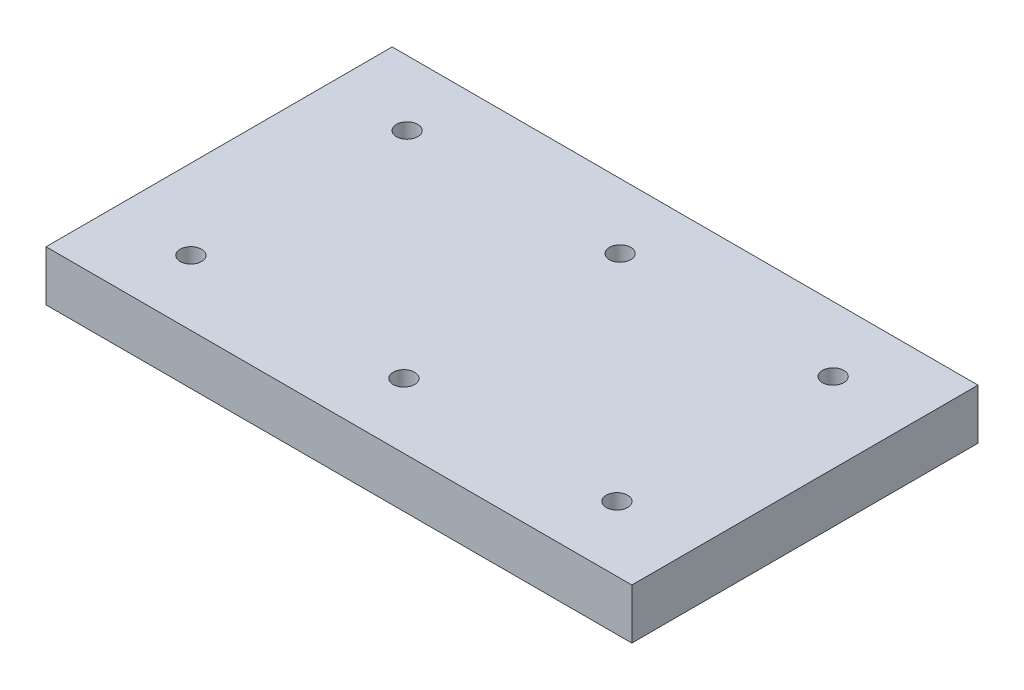
ISO-10303-21;
HEADER;
FILE_DESCRIPTION(('STEP AP214'),'2;1');
FILE_NAME('part.step','',(''),(''),'','','');
FILE_SCHEMA(('AUTOMOTIVE_DESIGN { 1 0 10303 214 1 1 1 1 }'));
ENDSEC;
DATA;
#1=APPLICATION_CONTEXT('core data for automotive mechanical design processes');
#2=APPLICATION_PROTOCOL_DEFINITION('international standard','automotive_design',2000,#1);
#3=PRODUCT_CONTEXT('',#1,'mechanical');
#4=PRODUCT('Part','Part','',(#3));
#5=PRODUCT_RELATED_PRODUCT_CATEGORY('part','',(#4));
#6=PRODUCT_DEFINITION_FORMATION('','',#4);
#7=PRODUCT_DEFINITION_CONTEXT('part definition',#1,'design');
#8=PRODUCT_DEFINITION('design','',#6,#7);
#9=PRODUCT_DEFINITION_SHAPE('','',#8);
#10=(LENGTH_UNIT() NAMED_UNIT(*) SI_UNIT(.MILLI.,.METRE.));
#11=(NAMED_UNIT(*) PLANE_ANGLE_UNIT() SI_UNIT($,.RADIAN.));
#12=(NAMED_UNIT(*) SI_UNIT($,.STERADIAN.) SOLID_ANGLE_UNIT());
#13=UNCERTAINTY_MEASURE_WITH_UNIT(LENGTH_MEASURE(1.E-05),#10,'distance_accuracy_value','');
#14=(GEOMETRIC_REPRESENTATION_CONTEXT(3) GLOBAL_UNCERTAINTY_ASSIGNED_CONTEXT((#13)) GLOBAL_UNIT_ASSIGNED_CONTEXT((#10,
#11,#12)) REPRESENTATION_CONTEXT('',''));
#15=CARTESIAN_POINT('',(0.,0.,0.));
#16=DIRECTION('',(0.,0.,1.));
#17=DIRECTION('',(1.,0.,0.));
#18=AXIS2_PLACEMENT_3D('',#15,#16,#17);
#19=CARTESIAN_POINT('',(69.85,12.,41.275));
#20=DIRECTION('',(-1.,0.,0.));
#21=DIRECTION('',(0.,0.,1.));
#22=AXIS2_PLACEMENT_3D('',#19,#20,#21);
#23=PLANE('',#22);
#24=DIRECTION('',(0.,0.,-1.));
#25=VECTOR('',#24,1.);
#26=CARTESIAN_POINT('',(69.85,0.,41.275));
#27=LINE('',#26,#25);
#28=CARTESIAN_POINT('',(69.85,0.,41.275));
#29=VERTEX_POINT('',#28);
#30=CARTESIAN_POINT('',(69.85,0.,-41.275));
#31=VERTEX_POINT('',#30);
#32=EDGE_CURVE('E100',#29,#31,#27,.T.);
#33=ORIENTED_EDGE('',*,*,#32,.T.);
#34=DIRECTION('',(0.,-1.,0.));
#35=VECTOR('',#34,1.);
#36=CARTESIAN_POINT('',(69.85,12.,-41.275));
#37=LINE('',#36,#35);
#38=CARTESIAN_POINT('',(69.85,12.,-41.275));
#39=VERTEX_POINT('',#38);
#40=EDGE_CURVE('E11',#39,#31,#37,.T.);
#41=ORIENTED_EDGE('',*,*,#40,.F.);
#42=DIRECTION('',(0.,0.,-1.));
#43=VECTOR('',#42,1.);
#44=CARTESIAN_POINT('',(69.85,12.,41.275));
#45=LINE('',#44,#43);
#46=CARTESIAN_POINT('',(69.85,12.,41.275));
#47=VERTEX_POINT('',#46);
#48=EDGE_CURVE('E88',#47,#39,#45,.T.);
#49=ORIENTED_EDGE('',*,*,#48,.F.);
#50=DIRECTION('',(0.,-1.,0.));
#51=VECTOR('',#50,1.);
#52=CARTESIAN_POINT('',(69.85,12.,41.275));
#53=LINE('',#52,#51);
#54=EDGE_CURVE('E96',#47,#29,#53,.T.);
#55=ORIENTED_EDGE('',*,*,#54,.T.);
#56=EDGE_LOOP('',(#33,#41,#49,#55));
#57=FACE_BOUND('',#56,.T.);
#58=ADVANCED_FACE('F37',(#57),#23,.F.);
#59=CARTESIAN_POINT('',(-69.85,12.,-41.275));
#60=DIRECTION('',(0.,0.,1.));
#61=DIRECTION('',(1.,0.,0.));
#62=AXIS2_PLACEMENT_3D('',#59,#60,#61);
#63=PLANE('',#62);
#64=DIRECTION('',(-1.,0.,0.));
#65=VECTOR('',#64,1.);
#66=CARTESIAN_POINT('',(-69.85,0.,-41.275));
#67=LINE('',#66,#65);
#68=CARTESIAN_POINT('',(-69.85,0.,-41.275));
#69=VERTEX_POINT('',#68);
#70=EDGE_CURVE('E92',#31,#69,#67,.T.);
#71=ORIENTED_EDGE('',*,*,#70,.T.);
#72=DIRECTION('',(0.,-1.,0.));
#73=VECTOR('',#72,1.);
#74=CARTESIAN_POINT('',(-69.85,12.,-41.275));
#75=LINE('',#74,#73);
#76=CARTESIAN_POINT('',(-69.85,12.,-41.275));
#77=VERTEX_POINT('',#76);
#78=EDGE_CURVE('E45',#77,#69,#75,.T.);
#79=ORIENTED_EDGE('',*,*,#78,.F.);
#80=DIRECTION('',(-1.,0.,0.));
#81=VECTOR('',#80,1.);
#82=CARTESIAN_POINT('',(-69.85,12.,-41.275));
#83=LINE('',#82,#81);
#84=EDGE_CURVE('E83',#39,#77,#83,.T.);
#85=ORIENTED_EDGE('',*,*,#84,.F.);
#86=ORIENTED_EDGE('',*,*,#40,.T.);
#87=EDGE_LOOP('',(#71,#79,#85,#86));
#88=FACE_BOUND('',#87,.T.);
#89=ADVANCED_FACE('F91',(#88),#63,.F.);
#90=CARTESIAN_POINT('',(-69.85,12.,41.275));
#91=DIRECTION('',(1.,0.,0.));
#92=DIRECTION('',(0.,0.,-1.));
#93=AXIS2_PLACEMENT_3D('',#90,#91,#92);
#94=PLANE('',#93);
#95=DIRECTION('',(0.,0.,1.));
#96=VECTOR('',#95,1.);
#97=CARTESIAN_POINT('',(-69.85,0.,41.275));
#98=LINE('',#97,#96);
#99=CARTESIAN_POINT('',(-69.85,0.,41.275));
#100=VERTEX_POINT('',#99);
#101=EDGE_CURVE('E70',#69,#100,#98,.T.);
#102=ORIENTED_EDGE('',*,*,#101,.T.);
#103=DIRECTION('',(0.,-1.,0.));
#104=VECTOR('',#103,1.);
#105=CARTESIAN_POINT('',(-69.85,12.,41.275));
#106=LINE('',#105,#104);
#107=CARTESIAN_POINT('',(-69.85,12.,41.275));
#108=VERTEX_POINT('',#107);
#109=EDGE_CURVE('E93',#108,#100,#106,.T.);
#110=ORIENTED_EDGE('',*,*,#109,.F.);
#111=DIRECTION('',(0.,0.,1.));
#112=VECTOR('',#111,1.);
#113=CARTESIAN_POINT('',(-69.85,12.,41.275));
#114=LINE('',#113,#112);
#115=EDGE_CURVE('E86',#77,#108,#114,.T.);
#116=ORIENTED_EDGE('',*,*,#115,.F.);
#117=ORIENTED_EDGE('',*,*,#78,.T.);
#118=EDGE_LOOP('',(#102,#110,#116,#117));
#119=FACE_BOUND('',#118,.T.);
#120=ADVANCED_FACE('F94',(#119),#94,.F.);
#121=CARTESIAN_POINT('',(-69.85,12.,41.275));
#122=DIRECTION('',(0.,0.,-1.));
#123=DIRECTION('',(-1.,0.,0.));
#124=AXIS2_PLACEMENT_3D('',#121,#122,#123);
#125=PLANE('',#124);
#126=DIRECTION('',(1.,0.,0.));
#127=VECTOR('',#126,1.);
#128=CARTESIAN_POINT('',(-69.85,0.,41.275));
#129=LINE('',#128,#127);
#130=EDGE_CURVE('E76',#100,#29,#129,.T.);
#131=ORIENTED_EDGE('',*,*,#130,.T.);
#132=ORIENTED_EDGE('',*,*,#54,.F.);
#133=DIRECTION('',(1.,0.,0.));
#134=VECTOR('',#133,1.);
#135=CARTESIAN_POINT('',(-69.85,12.,41.275));
#136=LINE('',#135,#134);
#137=EDGE_CURVE('E53',#108,#47,#136,.T.);
#138=ORIENTED_EDGE('',*,*,#137,.F.);
#139=ORIENTED_EDGE('',*,*,#109,.T.);
#140=EDGE_LOOP('',(#131,#132,#138,#139));
#141=FACE_BOUND('',#140,.T.);
#142=ADVANCED_FACE('F108',(#141),#125,.F.);
#143=CARTESIAN_POINT('',(0.,12.,0.));
#144=DIRECTION('',(0.,-1.,0.));
#145=DIRECTION('',(0.,0.,-1.));
#146=AXIS2_PLACEMENT_3D('',#143,#144,#145);
#147=PLANE('',#146);
#148=CARTESIAN_POINT('',(50.8,12.,-25.781));
#149=DIRECTION('',(0.,-1.,0.));
#150=DIRECTION('',(0.,0.,-1.));
#151=AXIS2_PLACEMENT_3D('',#148,#149,#150);
#152=CIRCLE('',#151,2.5527);
#153=CARTESIAN_POINT('',(50.8,12.,-28.3337));
#154=VERTEX_POINT('',#153);
#155=EDGE_CURVE('E143',#154,#154,#152,.T.);
#156=ORIENTED_EDGE('',*,*,#155,.T.);
#157=EDGE_LOOP('',(#156));
#158=FACE_BOUND('',#157,.T.);
#159=CARTESIAN_POINT('',(0.,12.,-25.781));
#160=DIRECTION('',(0.,-1.,0.));
#161=DIRECTION('',(0.,0.,-1.));
#162=AXIS2_PLACEMENT_3D('',#159,#160,#161);
#163=CIRCLE('',#162,2.5527);
#164=CARTESIAN_POINT('',(0.,12.,-28.3337));
#165=VERTEX_POINT('',#164);
#166=EDGE_CURVE('E137',#165,#165,#163,.T.);
#167=ORIENTED_EDGE('',*,*,#166,.T.);
#168=EDGE_LOOP('',(#167));
#169=FACE_BOUND('',#168,.T.);
#170=CARTESIAN_POINT('',(-50.8,12.,-25.781));
#171=DIRECTION('',(0.,-1.,0.));
#172=DIRECTION('',(0.,0.,-1.));
#173=AXIS2_PLACEMENT_3D('',#170,#171,#172);
#174=CIRCLE('',#173,2.5527);
#175=CARTESIAN_POINT('',(-50.8,12.,-28.3337));
#176=VERTEX_POINT('',#175);
#177=EDGE_CURVE('E131',#176,#176,#174,.T.);
#178=ORIENTED_EDGE('',*,*,#177,.T.);
#179=EDGE_LOOP('',(#178));
#180=FACE_BOUND('',#179,.T.);
#181=CARTESIAN_POINT('',(-50.8,12.,25.781));
#182=DIRECTION('',(0.,-1.,0.));
#183=DIRECTION('',(0.,0.,-1.));
#184=AXIS2_PLACEMENT_3D('',#181,#182,#183);
#185=CIRCLE('',#184,2.5527);
#186=CARTESIAN_POINT('',(-50.8,12.,23.2283));
#187=VERTEX_POINT('',#186);
#188=EDGE_CURVE('E125',#187,#187,#185,.T.);
#189=ORIENTED_EDGE('',*,*,#188,.T.);
#190=EDGE_LOOP('',(#189));
#191=FACE_BOUND('',#190,.T.);
#192=CARTESIAN_POINT('',(0.,12.,25.781));
#193=DIRECTION('',(0.,-1.,0.));
#194=DIRECTION('',(0.,0.,-1.));
#195=AXIS2_PLACEMENT_3D('',#192,#193,#194);
#196=CIRCLE('',#195,2.5527);
#197=CARTESIAN_POINT('',(0.,12.,23.2283));
#198=VERTEX_POINT('',#197);
#199=EDGE_CURVE('E119',#198,#198,#196,.T.);
#200=ORIENTED_EDGE('',*,*,#199,.T.);
#201=EDGE_LOOP('',(#200));
#202=FACE_BOUND('',#201,.T.);
#203=CARTESIAN_POINT('',(50.8,12.,25.781));
#204=DIRECTION('',(0.,-1.,0.));
#205=DIRECTION('',(0.,0.,-1.));
#206=AXIS2_PLACEMENT_3D('',#203,#204,#205);
#207=CIRCLE('',#206,2.5527);
#208=CARTESIAN_POINT('',(50.8,12.,23.2283));
#209=VERTEX_POINT('',#208);
#210=EDGE_CURVE('E103',#209,#209,#207,.T.);
#211=ORIENTED_EDGE('',*,*,#210,.T.);
#212=EDGE_LOOP('',(#211));
#213=FACE_BOUND('',#212,.T.);
#214=ORIENTED_EDGE('',*,*,#48,.T.);
#215=ORIENTED_EDGE('',*,*,#84,.T.);
#216=ORIENTED_EDGE('',*,*,#115,.T.);
#217=ORIENTED_EDGE('',*,*,#137,.T.);
#218=EDGE_LOOP('',(#214,#215,#216,#217));
#219=FACE_BOUND('',#218,.T.);
#220=ADVANCED_FACE('F84',(#158,#169,#180,#191,#202,#213,#219),#147,.F.);
#221=CARTESIAN_POINT('',(0.,0.,0.));
#222=DIRECTION('',(0.,-1.,0.));
#223=DIRECTION('',(0.,0.,-1.));
#224=AXIS2_PLACEMENT_3D('',#221,#222,#223);
#225=PLANE('',#224);
#226=CARTESIAN_POINT('',(50.8,0.,-25.781));
#227=DIRECTION('',(0.,-1.,0.));
#228=DIRECTION('',(0.,0.,-1.));
#229=AXIS2_PLACEMENT_3D('',#226,#227,#228);
#230=CIRCLE('',#229,2.5527);
#231=CARTESIAN_POINT('',(50.8,0.,-28.3337));
#232=VERTEX_POINT('',#231);
#233=EDGE_CURVE('E146',#232,#232,#230,.T.);
#234=ORIENTED_EDGE('',*,*,#233,.F.);
#235=EDGE_LOOP('',(#234));
#236=FACE_BOUND('',#235,.T.);
#237=CARTESIAN_POINT('',(0.,0.,-25.781));
#238=DIRECTION('',(0.,-1.,0.));
#239=DIRECTION('',(0.,0.,-1.));
#240=AXIS2_PLACEMENT_3D('',#237,#238,#239);
#241=CIRCLE('',#240,2.5527);
#242=CARTESIAN_POINT('',(0.,0.,-28.3337));
#243=VERTEX_POINT('',#242);
#244=EDGE_CURVE('E140',#243,#243,#241,.T.);
#245=ORIENTED_EDGE('',*,*,#244,.F.);
#246=EDGE_LOOP('',(#245));
#247=FACE_BOUND('',#246,.T.);
#248=CARTESIAN_POINT('',(-50.8,0.,-25.781));
#249=DIRECTION('',(0.,-1.,0.));
#250=DIRECTION('',(0.,0.,-1.));
#251=AXIS2_PLACEMENT_3D('',#248,#249,#250);
#252=CIRCLE('',#251,2.5527);
#253=CARTESIAN_POINT('',(-50.8,0.,-28.3337));
#254=VERTEX_POINT('',#253);
#255=EDGE_CURVE('E134',#254,#254,#252,.T.);
#256=ORIENTED_EDGE('',*,*,#255,.F.);
#257=EDGE_LOOP('',(#256));
#258=FACE_BOUND('',#257,.T.);
#259=CARTESIAN_POINT('',(-50.8,0.,25.781));
#260=DIRECTION('',(0.,-1.,0.));
#261=DIRECTION('',(0.,0.,-1.));
#262=AXIS2_PLACEMENT_3D('',#259,#260,#261);
#263=CIRCLE('',#262,2.5527);
#264=CARTESIAN_POINT('',(-50.8,0.,23.2283));
#265=VERTEX_POINT('',#264);
#266=EDGE_CURVE('E128',#265,#265,#263,.T.);
#267=ORIENTED_EDGE('',*,*,#266,.F.);
#268=EDGE_LOOP('',(#267));
#269=FACE_BOUND('',#268,.T.);
#270=CARTESIAN_POINT('',(0.,0.,25.781));
#271=DIRECTION('',(0.,-1.,0.));
#272=DIRECTION('',(0.,0.,-1.));
#273=AXIS2_PLACEMENT_3D('',#270,#271,#272);
#274=CIRCLE('',#273,2.5527);
#275=CARTESIAN_POINT('',(0.,0.,23.2283));
#276=VERTEX_POINT('',#275);
#277=EDGE_CURVE('E122',#276,#276,#274,.T.);
#278=ORIENTED_EDGE('',*,*,#277,.F.);
#279=EDGE_LOOP('',(#278));
#280=FACE_BOUND('',#279,.T.);
#281=CARTESIAN_POINT('',(50.8,0.,25.781));
#282=DIRECTION('',(0.,-1.,0.));
#283=DIRECTION('',(0.,0.,-1.));
#284=AXIS2_PLACEMENT_3D('',#281,#282,#283);
#285=CIRCLE('',#284,2.5527);
#286=CARTESIAN_POINT('',(50.8,0.,23.2283));
#287=VERTEX_POINT('',#286);
#288=EDGE_CURVE('E116',#287,#287,#285,.T.);
#289=ORIENTED_EDGE('',*,*,#288,.F.);
#290=EDGE_LOOP('',(#289));
#291=FACE_BOUND('',#290,.T.);
#292=ORIENTED_EDGE('',*,*,#32,.F.);
#293=ORIENTED_EDGE('',*,*,#130,.F.);
#294=ORIENTED_EDGE('',*,*,#101,.F.);
#295=ORIENTED_EDGE('',*,*,#70,.F.);
#296=EDGE_LOOP('',(#292,#293,#294,#295));
#297=FACE_BOUND('',#296,.T.);
#298=ADVANCED_FACE('F111',(#236,#247,#258,#269,#280,#291,#297),#225,.T.);
#299=CARTESIAN_POINT('',(50.8,0.,25.781));
#300=DIRECTION('',(0.,-1.,0.));
#301=DIRECTION('',(0.,0.,-1.));
#302=AXIS2_PLACEMENT_3D('',#299,#300,#301);
#303=CYLINDRICAL_SURFACE('',#302,2.5527);
#304=ORIENTED_EDGE('',*,*,#210,.F.);
#305=EDGE_LOOP('',(#304));
#306=FACE_BOUND('',#305,.T.);
#307=ORIENTED_EDGE('',*,*,#288,.T.);
#308=EDGE_LOOP('',(#307));
#309=FACE_BOUND('',#308,.T.);
#310=ADVANCED_FACE('F154',(#306,#309),#303,.F.);
#311=CARTESIAN_POINT('',(0.,0.,25.781));
#312=DIRECTION('',(0.,-1.,0.));
#313=DIRECTION('',(0.,0.,-1.));
#314=AXIS2_PLACEMENT_3D('',#311,#312,#313);
#315=CYLINDRICAL_SURFACE('',#314,2.5527);
#316=ORIENTED_EDGE('',*,*,#199,.F.);
#317=EDGE_LOOP('',(#316));
#318=FACE_BOUND('',#317,.T.);
#319=ORIENTED_EDGE('',*,*,#277,.T.);
#320=EDGE_LOOP('',(#319));
#321=FACE_BOUND('',#320,.T.);
#322=ADVANCED_FACE('F167',(#318,#321),#315,.F.);
#323=CARTESIAN_POINT('',(-50.8,0.,25.781));
#324=DIRECTION('',(0.,-1.,0.));
#325=DIRECTION('',(0.,0.,-1.));
#326=AXIS2_PLACEMENT_3D('',#323,#324,#325);
#327=CYLINDRICAL_SURFACE('',#326,2.5527);
#328=ORIENTED_EDGE('',*,*,#188,.F.);
#329=EDGE_LOOP('',(#328));
#330=FACE_BOUND('',#329,.T.);
#331=ORIENTED_EDGE('',*,*,#266,.T.);
#332=EDGE_LOOP('',(#331));
#333=FACE_BOUND('',#332,.T.);
#334=ADVANCED_FACE('F173',(#330,#333),#327,.F.);
#335=CARTESIAN_POINT('',(-50.8,0.,-25.781));
#336=DIRECTION('',(0.,-1.,0.));
#337=DIRECTION('',(0.,0.,-1.));
#338=AXIS2_PLACEMENT_3D('',#335,#336,#337);
#339=CYLINDRICAL_SURFACE('',#338,2.5527);
#340=ORIENTED_EDGE('',*,*,#177,.F.);
#341=EDGE_LOOP('',(#340));
#342=FACE_BOUND('',#341,.T.);
#343=ORIENTED_EDGE('',*,*,#255,.T.);
#344=EDGE_LOOP('',(#343));
#345=FACE_BOUND('',#344,.T.);
#346=ADVANCED_FACE('F206',(#342,#345),#339,.F.);
#347=CARTESIAN_POINT('',(0.,0.,-25.781));
#348=DIRECTION('',(0.,-1.,0.));
#349=DIRECTION('',(0.,0.,-1.));
#350=AXIS2_PLACEMENT_3D('',#347,#348,#349);
#351=CYLINDRICAL_SURFACE('',#350,2.5527);
#352=ORIENTED_EDGE('',*,*,#166,.F.);
#353=EDGE_LOOP('',(#352));
#354=FACE_BOUND('',#353,.T.);
#355=ORIENTED_EDGE('',*,*,#244,.T.);
#356=EDGE_LOOP('',(#355));
#357=FACE_BOUND('',#356,.T.);
#358=ADVANCED_FACE('F211',(#354,#357),#351,.F.);
#359=CARTESIAN_POINT('',(50.8,0.,-25.781));
#360=DIRECTION('',(0.,-1.,0.));
#361=DIRECTION('',(0.,0.,-1.));
#362=AXIS2_PLACEMENT_3D('',#359,#360,#361);
#363=CYLINDRICAL_SURFACE('',#362,2.5527);
#364=ORIENTED_EDGE('',*,*,#155,.F.);
#365=EDGE_LOOP('',(#364));
#366=FACE_BOUND('',#365,.T.);
#367=ORIENTED_EDGE('',*,*,#233,.T.);
#368=EDGE_LOOP('',(#367));
#369=FACE_BOUND('',#368,.T.);
#370=ADVANCED_FACE('F150',(#366,#369),#363,.F.);
#371=CLOSED_SHELL('',(#58,#89,#120,#142,#220,#298,#310,#322,#334,#346,#358,#370));
#372=MANIFOLD_SOLID_BREP('B2',#371);
#373=ADVANCED_BREP_SHAPE_REPRESENTATION('',(#18,#372),#14);
#374=SHAPE_DEFINITION_REPRESENTATION(#9,#373);
ENDSEC;
END-ISO-10303-21;
